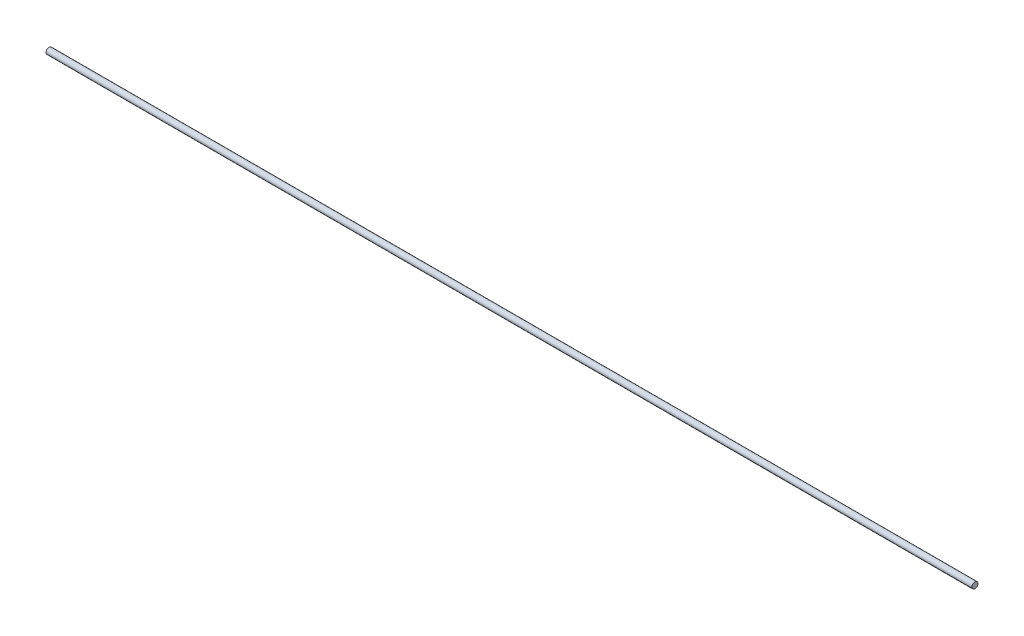
ISO-10303-21;
HEADER;
FILE_DESCRIPTION(('STEP AP214'),'2;1');
FILE_NAME('part.step','',(''),(''),'','','');
FILE_SCHEMA(('AUTOMOTIVE_DESIGN { 1 0 10303 214 1 1 1 1 }'));
ENDSEC;
DATA;
#1=APPLICATION_CONTEXT('core data for automotive mechanical design processes');
#2=APPLICATION_PROTOCOL_DEFINITION('international standard','automotive_design',2000,#1);
#3=PRODUCT_CONTEXT('',#1,'mechanical');
#4=PRODUCT('Part','Part','',(#3));
#5=PRODUCT_RELATED_PRODUCT_CATEGORY('part','',(#4));
#6=PRODUCT_DEFINITION_FORMATION('','',#4);
#7=PRODUCT_DEFINITION_CONTEXT('part definition',#1,'design');
#8=PRODUCT_DEFINITION('design','',#6,#7);
#9=PRODUCT_DEFINITION_SHAPE('','',#8);
#10=(LENGTH_UNIT() NAMED_UNIT(*) SI_UNIT(.MILLI.,.METRE.));
#11=(NAMED_UNIT(*) PLANE_ANGLE_UNIT() SI_UNIT($,.RADIAN.));
#12=(NAMED_UNIT(*) SI_UNIT($,.STERADIAN.) SOLID_ANGLE_UNIT());
#13=UNCERTAINTY_MEASURE_WITH_UNIT(LENGTH_MEASURE(1.E-05),#10,'distance_accuracy_value','');
#14=(GEOMETRIC_REPRESENTATION_CONTEXT(3) GLOBAL_UNCERTAINTY_ASSIGNED_CONTEXT((#13)) GLOBAL_UNIT_ASSIGNED_CONTEXT((#10,
#11,#12)) REPRESENTATION_CONTEXT('',''));
#15=CARTESIAN_POINT('',(0.,0.,0.));
#16=DIRECTION('',(0.,0.,1.));
#17=DIRECTION('',(1.,0.,0.));
#18=AXIS2_PLACEMENT_3D('',#15,#16,#17);
#19=CARTESIAN_POINT('',(607.815,0.,0.));
#20=DIRECTION('',(-1.,0.,0.));
#21=DIRECTION('',(0.,0.,1.));
#22=AXIS2_PLACEMENT_3D('',#19,#20,#21);
#23=CYLINDRICAL_SURFACE('',#22,4.);
#24=CARTESIAN_POINT('',(607.815,0.,0.));
#25=DIRECTION('',(1.,0.,0.));
#26=DIRECTION('',(0.,0.,-1.));
#27=AXIS2_PLACEMENT_3D('',#24,#25,#26);
#28=CIRCLE('',#27,4.);
#29=CARTESIAN_POINT('',(607.815,0.,-4.));
#30=VERTEX_POINT('',#29);
#31=EDGE_CURVE('E10',#30,#30,#28,.T.);
#32=ORIENTED_EDGE('',*,*,#31,.F.);
#33=EDGE_LOOP('',(#32));
#34=FACE_BOUND('',#33,.T.);
#35=CARTESIAN_POINT('',(-607.815,0.,0.));
#36=DIRECTION('',(1.,0.,0.));
#37=DIRECTION('',(0.,0.,-1.));
#38=AXIS2_PLACEMENT_3D('',#35,#36,#37);
#39=CIRCLE('',#38,4.);
#40=CARTESIAN_POINT('',(-607.815,0.,-4.));
#41=VERTEX_POINT('',#40);
#42=EDGE_CURVE('E46',#41,#41,#39,.T.);
#43=ORIENTED_EDGE('',*,*,#42,.T.);
#44=EDGE_LOOP('',(#43));
#45=FACE_BOUND('',#44,.T.);
#46=ADVANCED_FACE('F43',(#34,#45),#23,.T.);
#47=CARTESIAN_POINT('',(607.815,0.,0.));
#48=DIRECTION('',(1.,0.,0.));
#49=DIRECTION('',(0.,0.,-1.));
#50=AXIS2_PLACEMENT_3D('',#47,#48,#49);
#51=PLANE('',#50);
#52=ORIENTED_EDGE('',*,*,#31,.T.);
#53=EDGE_LOOP('',(#52));
#54=FACE_BOUND('',#53,.T.);
#55=ADVANCED_FACE('F60',(#54),#51,.T.);
#56=CARTESIAN_POINT('',(-607.815,0.,0.));
#57=DIRECTION('',(1.,0.,0.));
#58=DIRECTION('',(0.,0.,-1.));
#59=AXIS2_PLACEMENT_3D('',#56,#57,#58);
#60=PLANE('',#59);
#61=ORIENTED_EDGE('',*,*,#42,.F.);
#62=EDGE_LOOP('',(#61));
#63=FACE_BOUND('',#62,.T.);
#64=ADVANCED_FACE('F58',(#63),#60,.F.);
#65=CLOSED_SHELL('',(#46,#55,#64));
#66=MANIFOLD_SOLID_BREP('B2',#65);
#67=ADVANCED_BREP_SHAPE_REPRESENTATION('',(#18,#66),#14);
#68=SHAPE_DEFINITION_REPRESENTATION(#9,#67);
ENDSEC;
END-ISO-10303-21;
